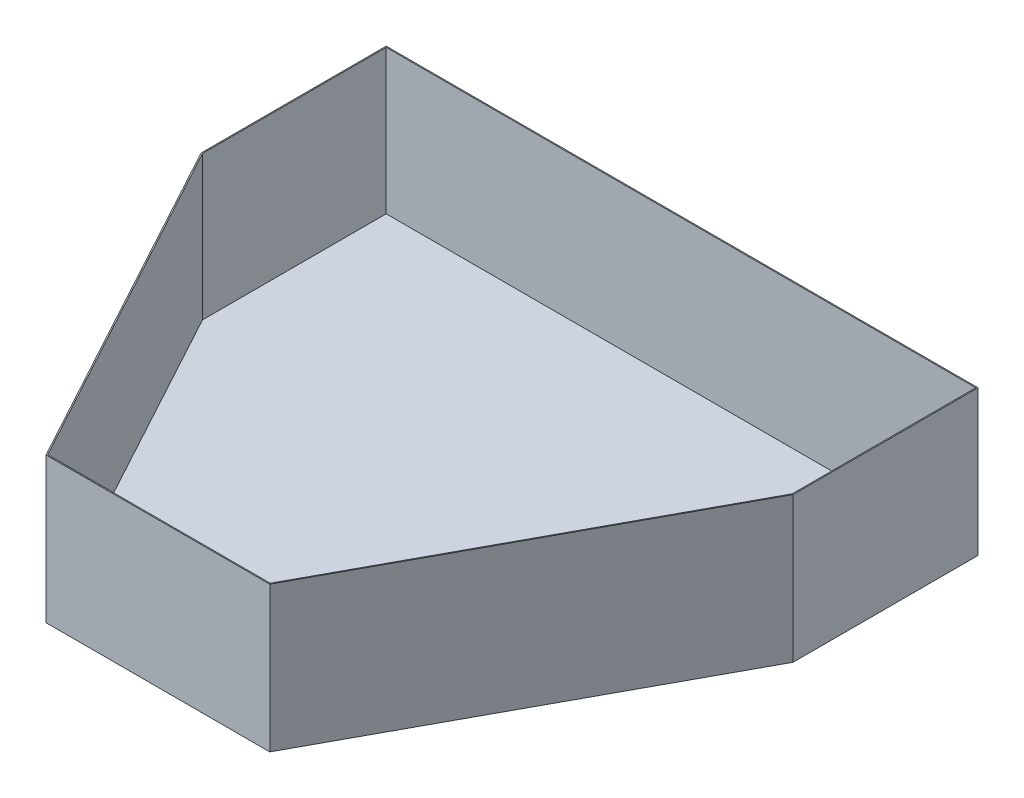
ISO-10303-21;
HEADER;
FILE_DESCRIPTION(('STEP AP214'),'2;1');
FILE_NAME('part.step','',(''),(''),'','','');
FILE_SCHEMA(('AUTOMOTIVE_DESIGN { 1 0 10303 214 1 1 1 1 }'));
ENDSEC;
DATA;
#1=APPLICATION_CONTEXT('core data for automotive mechanical design processes');
#2=APPLICATION_PROTOCOL_DEFINITION('international standard','automotive_design',2000,#1);
#3=PRODUCT_CONTEXT('',#1,'mechanical');
#4=PRODUCT('Part','Part','',(#3));
#5=PRODUCT_RELATED_PRODUCT_CATEGORY('part','',(#4));
#6=PRODUCT_DEFINITION_FORMATION('','',#4);
#7=PRODUCT_DEFINITION_CONTEXT('part definition',#1,'design');
#8=PRODUCT_DEFINITION('design','',#6,#7);
#9=PRODUCT_DEFINITION_SHAPE('','',#8);
#10=(LENGTH_UNIT() NAMED_UNIT(*) SI_UNIT(.MILLI.,.METRE.));
#11=(NAMED_UNIT(*) PLANE_ANGLE_UNIT() SI_UNIT($,.RADIAN.));
#12=(NAMED_UNIT(*) SI_UNIT($,.STERADIAN.) SOLID_ANGLE_UNIT());
#13=UNCERTAINTY_MEASURE_WITH_UNIT(LENGTH_MEASURE(1.E-05),#10,'distance_accuracy_value','');
#14=(GEOMETRIC_REPRESENTATION_CONTEXT(3) GLOBAL_UNCERTAINTY_ASSIGNED_CONTEXT((#13)) GLOBAL_UNIT_ASSIGNED_CONTEXT((#10,
#11,#12)) REPRESENTATION_CONTEXT('',''));
#15=CARTESIAN_POINT('',(0.,0.,0.));
#16=DIRECTION('',(0.,0.,1.));
#17=DIRECTION('',(1.,0.,0.));
#18=AXIS2_PLACEMENT_3D('',#15,#16,#17);
#19=CARTESIAN_POINT('',(550.,135.,344.));
#20=DIRECTION('',(-0.878975585716468,0.,-0.476866773548329));
#21=DIRECTION('',(-0.476866773548329,0.,0.878975585716468));
#22=AXIS2_PLACEMENT_3D('',#19,#20,#21);
#23=PLANE('',#22);
#24=DIRECTION('',(0.476866773548329,0.,-0.878975585716468));
#25=VECTOR('',#24,1.);
#26=CARTESIAN_POINT('',(550.,-135.,344.));
#27=LINE('',#26,#25);
#28=CARTESIAN_POINT('',(208.,-135.,974.384977502666));
#29=VERTEX_POINT('',#28);
#30=CARTESIAN_POINT('',(550.,-135.,344.));
#31=VERTEX_POINT('',#30);
#32=EDGE_CURVE('E138',#29,#31,#27,.T.);
#33=ORIENTED_EDGE('',*,*,#32,.T.);
#34=DIRECTION('',(0.,-1.,0.));
#35=VECTOR('',#34,1.);
#36=CARTESIAN_POINT('',(550.,135.,344.));
#37=LINE('',#36,#35);
#38=CARTESIAN_POINT('',(550.,135.,344.));
#39=VERTEX_POINT('',#38);
#40=EDGE_CURVE('E11',#39,#31,#37,.T.);
#41=ORIENTED_EDGE('',*,*,#40,.F.);
#42=DIRECTION('',(0.476866773548329,0.,-0.878975585716468));
#43=VECTOR('',#42,1.);
#44=CARTESIAN_POINT('',(550.,135.,344.));
#45=LINE('',#44,#43);
#46=CARTESIAN_POINT('',(208.,135.,974.384977502666));
#47=VERTEX_POINT('',#46);
#48=EDGE_CURVE('E150',#47,#39,#45,.T.);
#49=ORIENTED_EDGE('',*,*,#48,.F.);
#50=DIRECTION('',(0.,-1.,0.));
#51=VECTOR('',#50,1.);
#52=CARTESIAN_POINT('',(208.,135.,974.384977502666));
#53=LINE('',#52,#51);
#54=EDGE_CURVE('E134',#47,#29,#53,.T.);
#55=ORIENTED_EDGE('',*,*,#54,.T.);
#56=EDGE_LOOP('',(#33,#41,#49,#55));
#57=FACE_BOUND('',#56,.T.);
#58=ADVANCED_FACE('F43',(#57),#23,.F.);
#59=CARTESIAN_POINT('',(550.,135.,0.));
#60=DIRECTION('',(-1.,0.,0.));
#61=DIRECTION('',(0.,0.,1.));
#62=AXIS2_PLACEMENT_3D('',#59,#60,#61);
#63=PLANE('',#62);
#64=DIRECTION('',(0.,0.,-1.));
#65=VECTOR('',#64,1.);
#66=CARTESIAN_POINT('',(550.,-135.,0.));
#67=LINE('',#66,#65);
#68=CARTESIAN_POINT('',(550.,-135.,0.));
#69=VERTEX_POINT('',#68);
#70=EDGE_CURVE('E141',#31,#69,#67,.T.);
#71=ORIENTED_EDGE('',*,*,#70,.T.);
#72=DIRECTION('',(0.,-1.,0.));
#73=VECTOR('',#72,1.);
#74=CARTESIAN_POINT('',(550.,135.,0.));
#75=LINE('',#74,#73);
#76=CARTESIAN_POINT('',(550.,135.,0.));
#77=VERTEX_POINT('',#76);
#78=EDGE_CURVE('E50',#77,#69,#75,.T.);
#79=ORIENTED_EDGE('',*,*,#78,.F.);
#80=DIRECTION('',(0.,0.,-1.));
#81=VECTOR('',#80,1.);
#82=CARTESIAN_POINT('',(550.,135.,0.));
#83=LINE('',#82,#81);
#84=EDGE_CURVE('E101',#39,#77,#83,.T.);
#85=ORIENTED_EDGE('',*,*,#84,.F.);
#86=ORIENTED_EDGE('',*,*,#40,.T.);
#87=EDGE_LOOP('',(#71,#79,#85,#86));
#88=FACE_BOUND('',#87,.T.);
#89=ADVANCED_FACE('F273',(#88),#63,.F.);
#90=CARTESIAN_POINT('',(550.,135.,0.));
#91=DIRECTION('',(0.,0.,1.));
#92=DIRECTION('',(1.,0.,0.));
#93=AXIS2_PLACEMENT_3D('',#90,#91,#92);
#94=PLANE('',#93);
#95=DIRECTION('',(-1.,0.,0.));
#96=VECTOR('',#95,1.);
#97=CARTESIAN_POINT('',(550.,-135.,0.));
#98=LINE('',#97,#96);
#99=CARTESIAN_POINT('',(-550.,-135.,1.44402913937217E-13));
#100=VERTEX_POINT('',#99);
#101=EDGE_CURVE('E144',#69,#100,#98,.T.);
#102=ORIENTED_EDGE('',*,*,#101,.T.);
#103=DIRECTION('',(0.,-1.,0.));
#104=VECTOR('',#103,1.);
#105=CARTESIAN_POINT('',(-550.,135.,1.44402913937217E-13));
#106=LINE('',#105,#104);
#107=CARTESIAN_POINT('',(-550.,135.,1.44402913937217E-13));
#108=VERTEX_POINT('',#107);
#109=EDGE_CURVE('E129',#108,#100,#106,.T.);
#110=ORIENTED_EDGE('',*,*,#109,.F.);
#111=DIRECTION('',(-1.,0.,0.));
#112=VECTOR('',#111,1.);
#113=CARTESIAN_POINT('',(550.,135.,0.));
#114=LINE('',#113,#112);
#115=EDGE_CURVE('E117',#77,#108,#114,.T.);
#116=ORIENTED_EDGE('',*,*,#115,.F.);
#117=ORIENTED_EDGE('',*,*,#78,.T.);
#118=EDGE_LOOP('',(#102,#110,#116,#117));
#119=FACE_BOUND('',#118,.T.);
#120=ADVANCED_FACE('F156',(#119),#94,.F.);
#121=CARTESIAN_POINT('',(-550.,135.,1.44402913937217E-13));
#122=DIRECTION('',(1.,0.,0.));
#123=DIRECTION('',(0.,0.,-1.));
#124=AXIS2_PLACEMENT_3D('',#121,#122,#123);
#125=PLANE('',#124);
#126=DIRECTION('',(0.,0.,1.));
#127=VECTOR('',#126,1.);
#128=CARTESIAN_POINT('',(-550.,-135.,1.44402913937217E-13));
#129=LINE('',#128,#127);
#130=CARTESIAN_POINT('',(-550.,-135.,344.));
#131=VERTEX_POINT('',#130);
#132=EDGE_CURVE('E126',#100,#131,#129,.T.);
#133=ORIENTED_EDGE('',*,*,#132,.T.);
#134=DIRECTION('',(0.,-1.,0.));
#135=VECTOR('',#134,1.);
#136=CARTESIAN_POINT('',(-550.,135.,344.));
#137=LINE('',#136,#135);
#138=CARTESIAN_POINT('',(-550.,135.,344.));
#139=VERTEX_POINT('',#138);
#140=EDGE_CURVE('E123',#139,#131,#137,.T.);
#141=ORIENTED_EDGE('',*,*,#140,.F.);
#142=DIRECTION('',(0.,0.,1.));
#143=VECTOR('',#142,1.);
#144=CARTESIAN_POINT('',(-550.,135.,1.44402913937217E-13));
#145=LINE('',#144,#143);
#146=EDGE_CURVE('E110',#108,#139,#145,.T.);
#147=ORIENTED_EDGE('',*,*,#146,.F.);
#148=ORIENTED_EDGE('',*,*,#109,.T.);
#149=EDGE_LOOP('',(#133,#141,#147,#148));
#150=FACE_BOUND('',#149,.T.);
#151=ADVANCED_FACE('F124',(#150),#125,.F.);
#152=CARTESIAN_POINT('',(-550.,135.,344.));
#153=DIRECTION('',(0.878975585716468,0.,-0.476866773548329));
#154=DIRECTION('',(-0.476866773548329,0.,-0.878975585716468));
#155=AXIS2_PLACEMENT_3D('',#152,#153,#154);
#156=PLANE('',#155);
#157=DIRECTION('',(0.476866773548329,0.,0.878975585716468));
#158=VECTOR('',#157,1.);
#159=CARTESIAN_POINT('',(-550.,-135.,344.));
#160=LINE('',#159,#158);
#161=CARTESIAN_POINT('',(-208.,-135.,974.384977502666));
#162=VERTEX_POINT('',#161);
#163=EDGE_CURVE('E147',#131,#162,#160,.T.);
#164=ORIENTED_EDGE('',*,*,#163,.T.);
#165=DIRECTION('',(0.,-1.,0.));
#166=VECTOR('',#165,1.);
#167=CARTESIAN_POINT('',(-208.,135.,974.384977502666));
#168=LINE('',#167,#166);
#169=CARTESIAN_POINT('',(-208.,135.,974.384977502666));
#170=VERTEX_POINT('',#169);
#171=EDGE_CURVE('E130',#170,#162,#168,.T.);
#172=ORIENTED_EDGE('',*,*,#171,.F.);
#173=DIRECTION('',(0.476866773548329,0.,0.878975585716468));
#174=VECTOR('',#173,1.);
#175=CARTESIAN_POINT('',(-550.,135.,344.));
#176=LINE('',#175,#174);
#177=EDGE_CURVE('E114',#139,#170,#176,.T.);
#178=ORIENTED_EDGE('',*,*,#177,.F.);
#179=ORIENTED_EDGE('',*,*,#140,.T.);
#180=EDGE_LOOP('',(#164,#172,#178,#179));
#181=FACE_BOUND('',#180,.T.);
#182=ADVANCED_FACE('F132',(#181),#156,.F.);
#183=CARTESIAN_POINT('',(-208.,135.,974.384977502666));
#184=DIRECTION('',(0.,0.,-1.));
#185=DIRECTION('',(-1.,0.,0.));
#186=AXIS2_PLACEMENT_3D('',#183,#184,#185);
#187=PLANE('',#186);
#188=DIRECTION('',(1.,0.,0.));
#189=VECTOR('',#188,1.);
#190=CARTESIAN_POINT('',(-208.,-135.,974.384977502666));
#191=LINE('',#190,#189);
#192=EDGE_CURVE('E93',#162,#29,#191,.T.);
#193=ORIENTED_EDGE('',*,*,#192,.T.);
#194=ORIENTED_EDGE('',*,*,#54,.F.);
#195=DIRECTION('',(1.,0.,0.));
#196=VECTOR('',#195,1.);
#197=CARTESIAN_POINT('',(-208.,135.,974.384977502666));
#198=LINE('',#197,#196);
#199=EDGE_CURVE('E66',#170,#47,#198,.T.);
#200=ORIENTED_EDGE('',*,*,#199,.F.);
#201=ORIENTED_EDGE('',*,*,#171,.T.);
#202=EDGE_LOOP('',(#193,#194,#200,#201));
#203=FACE_BOUND('',#202,.T.);
#204=ADVANCED_FACE('F160',(#203),#187,.F.);
#205=CARTESIAN_POINT('',(0.,135.,0.));
#206=DIRECTION('',(0.,1.,0.));
#207=DIRECTION('',(0.,0.,1.));
#208=AXIS2_PLACEMENT_3D('',#205,#206,#207);
#209=PLANE('',#208);
#210=DIRECTION('',(0.476866773548329,0.,-0.878975585716468));
#211=VECTOR('',#210,1.);
#212=CARTESIAN_POINT('',(548.242048828567,135.,343.046266452903));
#213=LINE('',#212,#211);
#214=CARTESIAN_POINT('',(206.809675183355,135.,972.384977502666));
#215=VERTEX_POINT('',#214);
#216=CARTESIAN_POINT('',(548.,135.,343.492418339894));
#217=VERTEX_POINT('',#216);
#218=EDGE_CURVE('E181',#215,#217,#213,.T.);
#219=ORIENTED_EDGE('',*,*,#218,.F.);
#220=DIRECTION('',(1.,0.,0.));
#221=VECTOR('',#220,1.);
#222=CARTESIAN_POINT('',(-208.,135.,972.384977502666));
#223=LINE('',#222,#221);
#224=CARTESIAN_POINT('',(-206.809675183355,135.,972.384977502666));
#225=VERTEX_POINT('',#224);
#226=EDGE_CURVE('E167',#225,#215,#223,.T.);
#227=ORIENTED_EDGE('',*,*,#226,.F.);
#228=DIRECTION('',(0.476866773548329,0.,0.878975585716468));
#229=VECTOR('',#228,1.);
#230=CARTESIAN_POINT('',(-548.242048828567,135.,343.046266452903));
#231=LINE('',#230,#229);
#232=CARTESIAN_POINT('',(-548.,135.,343.492418339894));
#233=VERTEX_POINT('',#232);
#234=EDGE_CURVE('E170',#233,#225,#231,.T.);
#235=ORIENTED_EDGE('',*,*,#234,.F.);
#236=DIRECTION('',(0.,0.,1.));
#237=VECTOR('',#236,1.);
#238=CARTESIAN_POINT('',(-548.,135.,1.44402913937217E-13));
#239=LINE('',#238,#237);
#240=CARTESIAN_POINT('',(-548.,135.,2.00000000000014));
#241=VERTEX_POINT('',#240);
#242=EDGE_CURVE('E172',#241,#233,#239,.T.);
#243=ORIENTED_EDGE('',*,*,#242,.F.);
#244=DIRECTION('',(-1.,0.,0.));
#245=VECTOR('',#244,1.);
#246=CARTESIAN_POINT('',(550.,135.,2.00000000000001));
#247=LINE('',#246,#245);
#248=CARTESIAN_POINT('',(548.,135.,2.00000000000001));
#249=VERTEX_POINT('',#248);
#250=EDGE_CURVE('E175',#249,#241,#247,.T.);
#251=ORIENTED_EDGE('',*,*,#250,.F.);
#252=DIRECTION('',(0.,0.,-1.));
#253=VECTOR('',#252,1.);
#254=CARTESIAN_POINT('',(548.,135.,0.));
#255=LINE('',#254,#253);
#256=EDGE_CURVE('E178',#217,#249,#255,.T.);
#257=ORIENTED_EDGE('',*,*,#256,.F.);
#258=EDGE_LOOP('',(#219,#227,#235,#243,#251,#257));
#259=FACE_BOUND('',#258,.T.);
#260=ORIENTED_EDGE('',*,*,#48,.T.);
#261=ORIENTED_EDGE('',*,*,#84,.T.);
#262=ORIENTED_EDGE('',*,*,#115,.T.);
#263=ORIENTED_EDGE('',*,*,#146,.T.);
#264=ORIENTED_EDGE('',*,*,#177,.T.);
#265=ORIENTED_EDGE('',*,*,#199,.T.);
#266=EDGE_LOOP('',(#260,#261,#262,#263,#264,#265));
#267=FACE_BOUND('',#266,.T.);
#268=ADVANCED_FACE('F112',(#259,#267),#209,.T.);
#269=CARTESIAN_POINT('',(0.,-135.,0.));
#270=DIRECTION('',(0.,1.,0.));
#271=DIRECTION('',(0.,0.,1.));
#272=AXIS2_PLACEMENT_3D('',#269,#270,#271);
#273=PLANE('',#272);
#274=ORIENTED_EDGE('',*,*,#32,.F.);
#275=ORIENTED_EDGE('',*,*,#192,.F.);
#276=ORIENTED_EDGE('',*,*,#163,.F.);
#277=ORIENTED_EDGE('',*,*,#132,.F.);
#278=ORIENTED_EDGE('',*,*,#101,.F.);
#279=ORIENTED_EDGE('',*,*,#70,.F.);
#280=EDGE_LOOP('',(#274,#275,#276,#277,#278,#279));
#281=FACE_BOUND('',#280,.T.);
#282=ADVANCED_FACE('F159',(#281),#273,.F.);
#283=CARTESIAN_POINT('',(548.242048828567,135.,343.046266452903));
#284=DIRECTION('',(-0.878975585716468,0.,-0.476866773548329));
#285=DIRECTION('',(-0.476866773548329,0.,0.878975585716468));
#286=AXIS2_PLACEMENT_3D('',#283,#284,#285);
#287=PLANE('',#286);
#288=DIRECTION('',(0.476866773548329,0.,-0.878975585716468));
#289=VECTOR('',#288,1.);
#290=CARTESIAN_POINT('',(548.242048828567,-133.,343.046266452903));
#291=LINE('',#290,#289);
#292=CARTESIAN_POINT('',(206.809675183355,-133.,972.384977502666));
#293=VERTEX_POINT('',#292);
#294=CARTESIAN_POINT('',(548.,-133.,343.492418339894));
#295=VERTEX_POINT('',#294);
#296=EDGE_CURVE('E209',#293,#295,#291,.T.);
#297=ORIENTED_EDGE('',*,*,#296,.F.);
#298=DIRECTION('',(0.,-1.,0.));
#299=VECTOR('',#298,1.);
#300=CARTESIAN_POINT('',(206.809675183355,135.,972.384977502666));
#301=LINE('',#300,#299);
#302=EDGE_CURVE('E169',#215,#293,#301,.T.);
#303=ORIENTED_EDGE('',*,*,#302,.F.);
#304=ORIENTED_EDGE('',*,*,#218,.T.);
#305=DIRECTION('',(0.,-1.,0.));
#306=VECTOR('',#305,1.);
#307=CARTESIAN_POINT('',(548.,135.,343.492418339894));
#308=LINE('',#307,#306);
#309=EDGE_CURVE('E142',#217,#295,#308,.T.);
#310=ORIENTED_EDGE('',*,*,#309,.T.);
#311=EDGE_LOOP('',(#297,#303,#304,#310));
#312=FACE_BOUND('',#311,.T.);
#313=ADVANCED_FACE('F225',(#312),#287,.T.);
#314=CARTESIAN_POINT('',(548.,135.,0.));
#315=DIRECTION('',(-1.,0.,0.));
#316=DIRECTION('',(0.,0.,1.));
#317=AXIS2_PLACEMENT_3D('',#314,#315,#316);
#318=PLANE('',#317);
#319=DIRECTION('',(0.,0.,-1.));
#320=VECTOR('',#319,1.);
#321=CARTESIAN_POINT('',(548.,-133.,0.));
#322=LINE('',#321,#320);
#323=CARTESIAN_POINT('',(548.,-133.,2.00000000000001));
#324=VERTEX_POINT('',#323);
#325=EDGE_CURVE('E204',#295,#324,#322,.T.);
#326=ORIENTED_EDGE('',*,*,#325,.F.);
#327=ORIENTED_EDGE('',*,*,#309,.F.);
#328=ORIENTED_EDGE('',*,*,#256,.T.);
#329=DIRECTION('',(0.,-1.,0.));
#330=VECTOR('',#329,1.);
#331=CARTESIAN_POINT('',(548.,135.,2.00000000000001));
#332=LINE('',#331,#330);
#333=EDGE_CURVE('E201',#249,#324,#332,.T.);
#334=ORIENTED_EDGE('',*,*,#333,.T.);
#335=EDGE_LOOP('',(#326,#327,#328,#334));
#336=FACE_BOUND('',#335,.T.);
#337=ADVANCED_FACE('F251',(#336),#318,.T.);
#338=CARTESIAN_POINT('',(550.,135.,2.00000000000001));
#339=DIRECTION('',(0.,0.,1.));
#340=DIRECTION('',(1.,0.,0.));
#341=AXIS2_PLACEMENT_3D('',#338,#339,#340);
#342=PLANE('',#341);
#343=DIRECTION('',(-1.,0.,0.));
#344=VECTOR('',#343,1.);
#345=CARTESIAN_POINT('',(550.,-133.,2.00000000000001));
#346=LINE('',#345,#344);
#347=CARTESIAN_POINT('',(-548.,-133.,2.00000000000014));
#348=VERTEX_POINT('',#347);
#349=EDGE_CURVE('E198',#324,#348,#346,.T.);
#350=ORIENTED_EDGE('',*,*,#349,.F.);
#351=ORIENTED_EDGE('',*,*,#333,.F.);
#352=ORIENTED_EDGE('',*,*,#250,.T.);
#353=DIRECTION('',(0.,-1.,0.));
#354=VECTOR('',#353,1.);
#355=CARTESIAN_POINT('',(-548.,135.,2.00000000000014));
#356=LINE('',#355,#354);
#357=EDGE_CURVE('E195',#241,#348,#356,.T.);
#358=ORIENTED_EDGE('',*,*,#357,.T.);
#359=EDGE_LOOP('',(#350,#351,#352,#358));
#360=FACE_BOUND('',#359,.T.);
#361=ADVANCED_FACE('F257',(#360),#342,.T.);
#362=CARTESIAN_POINT('',(-548.,135.,1.44402913937217E-13));
#363=DIRECTION('',(1.,0.,0.));
#364=DIRECTION('',(0.,0.,-1.));
#365=AXIS2_PLACEMENT_3D('',#362,#363,#364);
#366=PLANE('',#365);
#367=DIRECTION('',(0.,0.,1.));
#368=VECTOR('',#367,1.);
#369=CARTESIAN_POINT('',(-548.,-133.,1.44402913937217E-13));
#370=LINE('',#369,#368);
#371=CARTESIAN_POINT('',(-548.,-133.,343.492418339894));
#372=VERTEX_POINT('',#371);
#373=EDGE_CURVE('E192',#348,#372,#370,.T.);
#374=ORIENTED_EDGE('',*,*,#373,.F.);
#375=ORIENTED_EDGE('',*,*,#357,.F.);
#376=ORIENTED_EDGE('',*,*,#242,.T.);
#377=DIRECTION('',(0.,-1.,0.));
#378=VECTOR('',#377,1.);
#379=CARTESIAN_POINT('',(-548.,135.,343.492418339894));
#380=LINE('',#379,#378);
#381=EDGE_CURVE('E189',#233,#372,#380,.T.);
#382=ORIENTED_EDGE('',*,*,#381,.T.);
#383=EDGE_LOOP('',(#374,#375,#376,#382));
#384=FACE_BOUND('',#383,.T.);
#385=ADVANCED_FACE('F261',(#384),#366,.T.);
#386=CARTESIAN_POINT('',(-548.242048828567,135.,343.046266452903));
#387=DIRECTION('',(0.878975585716468,0.,-0.476866773548329));
#388=DIRECTION('',(-0.476866773548329,0.,-0.878975585716468));
#389=AXIS2_PLACEMENT_3D('',#386,#387,#388);
#390=PLANE('',#389);
#391=DIRECTION('',(0.476866773548329,0.,0.878975585716468));
#392=VECTOR('',#391,1.);
#393=CARTESIAN_POINT('',(-548.242048828567,-133.,343.046266452903));
#394=LINE('',#393,#392);
#395=CARTESIAN_POINT('',(-206.809675183355,-133.,972.384977502666));
#396=VERTEX_POINT('',#395);
#397=EDGE_CURVE('E187',#372,#396,#394,.T.);
#398=ORIENTED_EDGE('',*,*,#397,.F.);
#399=ORIENTED_EDGE('',*,*,#381,.F.);
#400=ORIENTED_EDGE('',*,*,#234,.T.);
#401=DIRECTION('',(0.,-1.,0.));
#402=VECTOR('',#401,1.);
#403=CARTESIAN_POINT('',(-206.809675183355,135.,972.384977502666));
#404=LINE('',#403,#402);
#405=EDGE_CURVE('E57',#225,#396,#404,.T.);
#406=ORIENTED_EDGE('',*,*,#405,.T.);
#407=EDGE_LOOP('',(#398,#399,#400,#406));
#408=FACE_BOUND('',#407,.T.);
#409=ADVANCED_FACE('F263',(#408),#390,.T.);
#410=CARTESIAN_POINT('',(-208.,135.,972.384977502666));
#411=DIRECTION('',(0.,0.,-1.));
#412=DIRECTION('',(-1.,0.,0.));
#413=AXIS2_PLACEMENT_3D('',#410,#411,#412);
#414=PLANE('',#413);
#415=DIRECTION('',(1.,0.,0.));
#416=VECTOR('',#415,1.);
#417=CARTESIAN_POINT('',(-208.,-133.,972.384977502666));
#418=LINE('',#417,#416);
#419=EDGE_CURVE('E184',#396,#293,#418,.T.);
#420=ORIENTED_EDGE('',*,*,#419,.F.);
#421=ORIENTED_EDGE('',*,*,#405,.F.);
#422=ORIENTED_EDGE('',*,*,#226,.T.);
#423=ORIENTED_EDGE('',*,*,#302,.T.);
#424=EDGE_LOOP('',(#420,#421,#422,#423));
#425=FACE_BOUND('',#424,.T.);
#426=ADVANCED_FACE('F245',(#425),#414,.T.);
#427=CARTESIAN_POINT('',(0.,-133.,0.));
#428=DIRECTION('',(0.,1.,0.));
#429=DIRECTION('',(0.,0.,1.));
#430=AXIS2_PLACEMENT_3D('',#427,#428,#429);
#431=PLANE('',#430);
#432=ORIENTED_EDGE('',*,*,#296,.T.);
#433=ORIENTED_EDGE('',*,*,#325,.T.);
#434=ORIENTED_EDGE('',*,*,#349,.T.);
#435=ORIENTED_EDGE('',*,*,#373,.T.);
#436=ORIENTED_EDGE('',*,*,#397,.T.);
#437=ORIENTED_EDGE('',*,*,#419,.T.);
#438=EDGE_LOOP('',(#432,#433,#434,#435,#436,#437));
#439=FACE_BOUND('',#438,.T.);
#440=ADVANCED_FACE('F218',(#439),#431,.T.);
#441=CLOSED_SHELL('',(#58,#89,#120,#151,#182,#204,#268,#282,#313,#337,#361,#385,#409,#426,#440));
#442=MANIFOLD_SOLID_BREP('B2',#441);
#443=ADVANCED_BREP_SHAPE_REPRESENTATION('',(#18,#442),#14);
#444=SHAPE_DEFINITION_REPRESENTATION(#9,#443);
ENDSEC;
END-ISO-10303-21;
